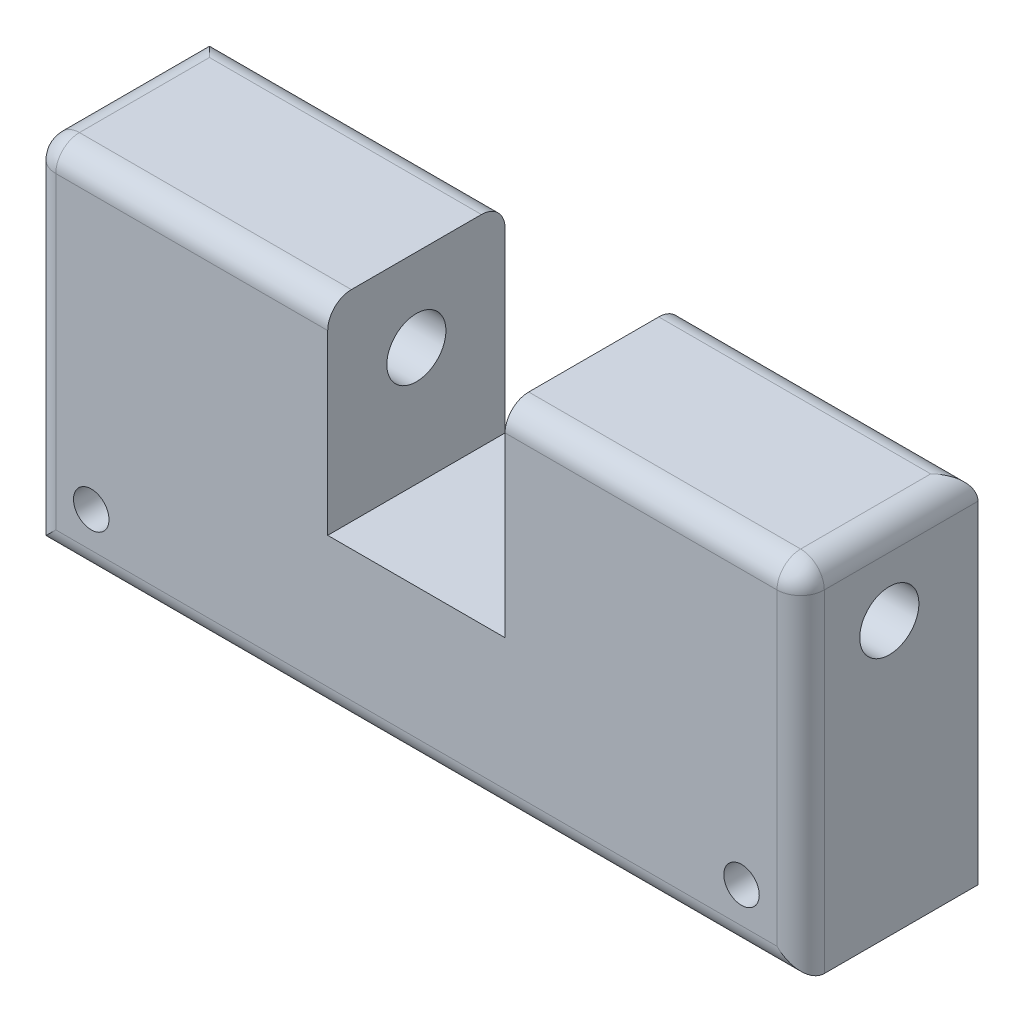
ISO-10303-21;
HEADER;
FILE_DESCRIPTION(('STEP AP214'),'2;1');
FILE_NAME('part.step','',(''),(''),'','','');
FILE_SCHEMA(('AUTOMOTIVE_DESIGN { 1 0 10303 214 1 1 1 1 }'));
ENDSEC;
DATA;
#1=APPLICATION_CONTEXT('core data for automotive mechanical design processes');
#2=APPLICATION_PROTOCOL_DEFINITION('international standard','automotive_design',2000,#1);
#3=PRODUCT_CONTEXT('',#1,'mechanical');
#4=PRODUCT('Part','Part','',(#3));
#5=PRODUCT_RELATED_PRODUCT_CATEGORY('part','',(#4));
#6=PRODUCT_DEFINITION_FORMATION('','',#4);
#7=PRODUCT_DEFINITION_CONTEXT('part definition',#1,'design');
#8=PRODUCT_DEFINITION('design','',#6,#7);
#9=PRODUCT_DEFINITION_SHAPE('','',#8);
#10=(LENGTH_UNIT() NAMED_UNIT(*) SI_UNIT(.MILLI.,.METRE.));
#11=(NAMED_UNIT(*) PLANE_ANGLE_UNIT() SI_UNIT($,.RADIAN.));
#12=(NAMED_UNIT(*) SI_UNIT($,.STERADIAN.) SOLID_ANGLE_UNIT());
#13=UNCERTAINTY_MEASURE_WITH_UNIT(LENGTH_MEASURE(1.E-05),#10,'distance_accuracy_value','');
#14=(GEOMETRIC_REPRESENTATION_CONTEXT(3) GLOBAL_UNCERTAINTY_ASSIGNED_CONTEXT((#13)) GLOBAL_UNIT_ASSIGNED_CONTEXT((#10,
#11,#12)) REPRESENTATION_CONTEXT('',''));
#15=CARTESIAN_POINT('',(0.,0.,0.));
#16=DIRECTION('',(0.,0.,1.));
#17=DIRECTION('',(1.,0.,0.));
#18=AXIS2_PLACEMENT_3D('',#15,#16,#17);
#19=CARTESIAN_POINT('',(-22.4999999999999,15.5999999999998,15.));
#20=DIRECTION('',(0.,-1.,0.));
#21=DIRECTION('',(0.,0.,-1.));
#22=AXIS2_PLACEMENT_3D('',#19,#20,#21);
#23=PLANE('',#22);
#24=DIRECTION('',(0.,0.,1.));
#25=VECTOR('',#24,1.);
#26=CARTESIAN_POINT('',(2.50000000000001,15.5999999999998,-60.));
#27=LINE('',#26,#25);
#28=CARTESIAN_POINT('',(2.50000000000001,15.5999999999998,2.));
#29=VERTEX_POINT('',#28);
#30=CARTESIAN_POINT('',(2.50000000000001,15.5999999999998,13.));
#31=VERTEX_POINT('',#30);
#32=EDGE_CURVE('E162',#29,#31,#27,.T.);
#33=ORIENTED_EDGE('',*,*,#32,.F.);
#34=DIRECTION('',(-1.,0.,0.));
#35=VECTOR('',#34,1.);
#36=CARTESIAN_POINT('',(-22.4999999999999,15.5999999999998,2.));
#37=LINE('',#36,#35);
#38=CARTESIAN_POINT('',(-20.4999999999999,15.5999999999998,2.));
#39=VERTEX_POINT('',#38);
#40=EDGE_CURVE('E219',#29,#39,#37,.T.);
#41=ORIENTED_EDGE('',*,*,#40,.T.);
#42=DIRECTION('',(0.,0.,-1.));
#43=VECTOR('',#42,1.);
#44=CARTESIAN_POINT('',(-20.4999999999999,15.5999999999998,15.));
#45=LINE('',#44,#43);
#46=CARTESIAN_POINT('',(-20.4999999999999,15.5999999999998,13.));
#47=VERTEX_POINT('',#46);
#48=EDGE_CURVE('E217',#39,#47,#45,.F.);
#49=ORIENTED_EDGE('',*,*,#48,.T.);
#50=DIRECTION('',(-1.,0.,0.));
#51=VECTOR('',#50,1.);
#52=CARTESIAN_POINT('',(-22.4999999999999,15.5999999999998,13.));
#53=LINE('',#52,#51);
#54=EDGE_CURVE('E215',#47,#31,#53,.F.);
#55=ORIENTED_EDGE('',*,*,#54,.T.);
#56=EDGE_LOOP('',(#33,#41,#49,#55));
#57=FACE_BOUND('',#56,.T.);
#58=ADVANCED_FACE('F32',(#57),#23,.F.);
#59=CARTESIAN_POINT('',(52.5000000000001,8.59999999999981,7.5));
#60=DIRECTION('',(-1.,0.,0.));
#61=DIRECTION('',(0.,0.,1.));
#62=AXIS2_PLACEMENT_3D('',#59,#60,#61);
#63=CYLINDRICAL_SURFACE('',#62,2.5);
#64=CARTESIAN_POINT('',(2.50000000000001,8.59999999999981,7.5));
#65=DIRECTION('',(-1.,0.,0.));
#66=DIRECTION('',(0.,-1.,0.));
#67=AXIS2_PLACEMENT_3D('',#64,#65,#66);
#68=CIRCLE('',#67,2.5);
#69=CARTESIAN_POINT('',(2.50000000000001,6.09999999999981,7.5));
#70=VERTEX_POINT('',#69);
#71=EDGE_CURVE('E171',#70,#70,#68,.F.);
#72=ORIENTED_EDGE('',*,*,#71,.T.);
#73=EDGE_LOOP('',(#72));
#74=FACE_BOUND('',#73,.T.);
#75=CARTESIAN_POINT('',(-22.4999999999999,8.59999999999981,7.5));
#76=DIRECTION('',(-1.,0.,0.));
#77=DIRECTION('',(0.,0.,1.));
#78=AXIS2_PLACEMENT_3D('',#75,#76,#77);
#79=CIRCLE('',#78,2.5);
#80=CARTESIAN_POINT('',(-22.4999999999999,8.59999999999981,10.));
#81=VERTEX_POINT('',#80);
#82=EDGE_CURVE('E174',#81,#81,#79,.T.);
#83=ORIENTED_EDGE('',*,*,#82,.T.);
#84=EDGE_LOOP('',(#83));
#85=FACE_BOUND('',#84,.T.);
#86=ADVANCED_FACE('F352',(#74,#85),#63,.F.);
#87=CARTESIAN_POINT('',(0.,0.,15.));
#88=DIRECTION('',(0.,0.,-1.));
#89=DIRECTION('',(-1.,0.,0.));
#90=AXIS2_PLACEMENT_3D('',#87,#88,#89);
#91=PLANE('',#90);
#92=DIRECTION('',(0.,1.,0.));
#93=VECTOR('',#92,1.);
#94=CARTESIAN_POINT('',(40.5,0.,15.));
#95=LINE('',#94,#93);
#96=CARTESIAN_POINT('',(40.5,-12.5,15.));
#97=VERTEX_POINT('',#96);
#98=CARTESIAN_POINT('',(40.5,13.5999999999998,15.));
#99=VERTEX_POINT('',#98);
#100=EDGE_CURVE('E49',#97,#99,#95,.T.);
#101=ORIENTED_EDGE('',*,*,#100,.T.);
#102=DIRECTION('',(-1.,0.,0.));
#103=VECTOR('',#102,1.);
#104=CARTESIAN_POINT('',(0.,13.5999999999998,15.));
#105=LINE('',#104,#103);
#106=CARTESIAN_POINT('',(17.5,13.5999999999998,15.));
#107=VERTEX_POINT('',#106);
#108=EDGE_CURVE('E41',#99,#107,#105,.T.);
#109=ORIENTED_EDGE('',*,*,#108,.T.);
#110=DIRECTION('',(0.,1.,0.));
#111=VECTOR('',#110,1.);
#112=CARTESIAN_POINT('',(17.5,15.5999999999998,15.));
#113=LINE('',#112,#111);
#114=CARTESIAN_POINT('',(17.5,-1.40000000000019,15.));
#115=VERTEX_POINT('',#114);
#116=EDGE_CURVE('E154',#115,#107,#113,.T.);
#117=ORIENTED_EDGE('',*,*,#116,.F.);
#118=DIRECTION('',(1.,0.,0.));
#119=VECTOR('',#118,1.);
#120=CARTESIAN_POINT('',(2.50000000000001,-1.40000000000019,15.));
#121=LINE('',#120,#119);
#122=CARTESIAN_POINT('',(2.50000000000001,-1.40000000000019,15.));
#123=VERTEX_POINT('',#122);
#124=EDGE_CURVE('E144',#123,#115,#121,.T.);
#125=ORIENTED_EDGE('',*,*,#124,.F.);
#126=DIRECTION('',(0.,-1.,0.));
#127=VECTOR('',#126,1.);
#128=CARTESIAN_POINT('',(2.50000000000001,15.5999999999998,15.));
#129=LINE('',#128,#127);
#130=CARTESIAN_POINT('',(2.50000000000001,13.5999999999998,15.));
#131=VERTEX_POINT('',#130);
#132=EDGE_CURVE('E132',#131,#123,#129,.T.);
#133=ORIENTED_EDGE('',*,*,#132,.F.);
#134=DIRECTION('',(-1.,0.,0.));
#135=VECTOR('',#134,1.);
#136=CARTESIAN_POINT('',(0.,13.5999999999998,15.));
#137=LINE('',#136,#135);
#138=CARTESIAN_POINT('',(-20.4999999999999,13.5999999999998,15.));
#139=VERTEX_POINT('',#138);
#140=EDGE_CURVE('E245',#131,#139,#137,.T.);
#141=ORIENTED_EDGE('',*,*,#140,.T.);
#142=DIRECTION('',(0.,-1.,0.));
#143=VECTOR('',#142,1.);
#144=CARTESIAN_POINT('',(-20.4999999999999,0.,15.));
#145=LINE('',#144,#143);
#146=CARTESIAN_POINT('',(-20.4999999999999,-12.5,15.));
#147=VERTEX_POINT('',#146);
#148=EDGE_CURVE('E242',#139,#147,#145,.T.);
#149=ORIENTED_EDGE('',*,*,#148,.T.);
#150=DIRECTION('',(1.,0.,0.));
#151=VECTOR('',#150,1.);
#152=CARTESIAN_POINT('',(0.,-12.5,15.));
#153=LINE('',#152,#151);
#154=EDGE_CURVE('E54',#147,#97,#153,.T.);
#155=ORIENTED_EDGE('',*,*,#154,.T.);
#156=EDGE_LOOP('',(#101,#109,#117,#125,#133,#141,#149,#155));
#157=FACE_BOUND('',#156,.T.);
#158=CARTESIAN_POINT('',(-17.4999999999999,-9.5,15.));
#159=DIRECTION('',(0.,0.,1.));
#160=DIRECTION('',(1.,0.,0.));
#161=AXIS2_PLACEMENT_3D('',#158,#159,#160);
#162=CIRCLE('',#161,1.5);
#163=CARTESIAN_POINT('',(-15.9999999999999,-9.5,15.));
#164=VERTEX_POINT('',#163);
#165=EDGE_CURVE('E185',#164,#164,#162,.T.);
#166=ORIENTED_EDGE('',*,*,#165,.F.);
#167=EDGE_LOOP('',(#166));
#168=FACE_BOUND('',#167,.T.);
#169=CARTESIAN_POINT('',(37.5,-9.50000000000001,15.));
#170=DIRECTION('',(0.,0.,1.));
#171=DIRECTION('',(1.,0.,0.));
#172=AXIS2_PLACEMENT_3D('',#169,#170,#171);
#173=CIRCLE('',#172,1.5);
#174=CARTESIAN_POINT('',(39.,-9.50000000000001,15.));
#175=VERTEX_POINT('',#174);
#176=EDGE_CURVE('E178',#175,#175,#173,.T.);
#177=ORIENTED_EDGE('',*,*,#176,.F.);
#178=EDGE_LOOP('',(#177));
#179=FACE_BOUND('',#178,.T.);
#180=ADVANCED_FACE('F156',(#157,#168,#179),#91,.F.);
#181=CARTESIAN_POINT('',(0.,0.,0.));
#182=DIRECTION('',(0.,0.,-1.));
#183=DIRECTION('',(-1.,0.,0.));
#184=AXIS2_PLACEMENT_3D('',#181,#182,#183);
#185=PLANE('',#184);
#186=DIRECTION('',(0.,-1.,0.));
#187=VECTOR('',#186,1.);
#188=CARTESIAN_POINT('',(17.5,0.,0.));
#189=LINE('',#188,#187);
#190=CARTESIAN_POINT('',(17.5,13.5999999999998,0.));
#191=VERTEX_POINT('',#190);
#192=CARTESIAN_POINT('',(17.5,-1.40000000000019,0.));
#193=VERTEX_POINT('',#192);
#194=EDGE_CURVE('E169',#191,#193,#189,.T.);
#195=ORIENTED_EDGE('',*,*,#194,.F.);
#196=DIRECTION('',(-1.,0.,0.));
#197=VECTOR('',#196,1.);
#198=CARTESIAN_POINT('',(42.5,13.5999999999998,0.));
#199=LINE('',#198,#197);
#200=CARTESIAN_POINT('',(42.5,13.5999999999998,0.));
#201=VERTEX_POINT('',#200);
#202=EDGE_CURVE('E237',#191,#201,#199,.F.);
#203=ORIENTED_EDGE('',*,*,#202,.T.);
#204=DIRECTION('',(0.,1.,0.));
#205=VECTOR('',#204,1.);
#206=CARTESIAN_POINT('',(42.5,-14.5,0.));
#207=LINE('',#206,#205);
#208=CARTESIAN_POINT('',(42.5,-14.5,0.));
#209=VERTEX_POINT('',#208);
#210=EDGE_CURVE('E196',#209,#201,#207,.T.);
#211=ORIENTED_EDGE('',*,*,#210,.F.);
#212=DIRECTION('',(1.,0.,0.));
#213=VECTOR('',#212,1.);
#214=CARTESIAN_POINT('',(-22.4999999999999,-14.5,0.));
#215=LINE('',#214,#213);
#216=CARTESIAN_POINT('',(-22.4999999999999,-14.5,0.));
#217=VERTEX_POINT('',#216);
#218=EDGE_CURVE('E193',#217,#209,#215,.T.);
#219=ORIENTED_EDGE('',*,*,#218,.F.);
#220=DIRECTION('',(0.,-1.,0.));
#221=VECTOR('',#220,1.);
#222=CARTESIAN_POINT('',(-22.4999999999999,-14.5,0.));
#223=LINE('',#222,#221);
#224=CARTESIAN_POINT('',(-22.4999999999999,13.5999999999998,0.));
#225=VERTEX_POINT('',#224);
#226=EDGE_CURVE('E188',#225,#217,#223,.T.);
#227=ORIENTED_EDGE('',*,*,#226,.F.);
#228=DIRECTION('',(-1.,0.,0.));
#229=VECTOR('',#228,1.);
#230=CARTESIAN_POINT('',(2.50000000000001,13.5999999999998,0.));
#231=LINE('',#230,#229);
#232=CARTESIAN_POINT('',(2.50000000000001,13.5999999999998,0.));
#233=VERTEX_POINT('',#232);
#234=EDGE_CURVE('E235',#225,#233,#231,.F.);
#235=ORIENTED_EDGE('',*,*,#234,.T.);
#236=DIRECTION('',(0.,1.,0.));
#237=VECTOR('',#236,1.);
#238=CARTESIAN_POINT('',(2.50000000000001,0.,0.));
#239=LINE('',#238,#237);
#240=CARTESIAN_POINT('',(2.50000000000001,-1.40000000000019,0.));
#241=VERTEX_POINT('',#240);
#242=EDGE_CURVE('E172',#241,#233,#239,.T.);
#243=ORIENTED_EDGE('',*,*,#242,.F.);
#244=DIRECTION('',(-1.,0.,0.));
#245=VECTOR('',#244,1.);
#246=CARTESIAN_POINT('',(0.,-1.40000000000019,0.));
#247=LINE('',#246,#245);
#248=EDGE_CURVE('E152',#193,#241,#247,.T.);
#249=ORIENTED_EDGE('',*,*,#248,.F.);
#250=EDGE_LOOP('',(#195,#203,#211,#219,#227,#235,#243,#249));
#251=FACE_BOUND('',#250,.T.);
#252=CARTESIAN_POINT('',(-17.4999999999999,-9.5,0.));
#253=DIRECTION('',(0.,0.,1.));
#254=DIRECTION('',(1.,0.,0.));
#255=AXIS2_PLACEMENT_3D('',#252,#253,#254);
#256=CIRCLE('',#255,1.5);
#257=CARTESIAN_POINT('',(-15.9999999999999,-9.5,0.));
#258=VERTEX_POINT('',#257);
#259=EDGE_CURVE('E181',#258,#258,#256,.T.);
#260=ORIENTED_EDGE('',*,*,#259,.T.);
#261=EDGE_LOOP('',(#260));
#262=FACE_BOUND('',#261,.T.);
#263=CARTESIAN_POINT('',(37.5,-9.50000000000001,0.));
#264=DIRECTION('',(0.,0.,1.));
#265=DIRECTION('',(1.,0.,0.));
#266=AXIS2_PLACEMENT_3D('',#263,#264,#265);
#267=CIRCLE('',#266,1.5);
#268=CARTESIAN_POINT('',(39.,-9.50000000000001,0.));
#269=VERTEX_POINT('',#268);
#270=EDGE_CURVE('E182',#269,#269,#267,.T.);
#271=ORIENTED_EDGE('',*,*,#270,.T.);
#272=EDGE_LOOP('',(#271));
#273=FACE_BOUND('',#272,.T.);
#274=ADVANCED_FACE('F314',(#251,#262,#273),#185,.T.);
#275=CARTESIAN_POINT('',(-22.4999999999999,-14.5,15.));
#276=DIRECTION('',(1.,0.,0.));
#277=DIRECTION('',(0.,0.,-1.));
#278=AXIS2_PLACEMENT_3D('',#275,#276,#277);
#279=PLANE('',#278);
#280=ORIENTED_EDGE('',*,*,#82,.F.);
#281=EDGE_LOOP('',(#280));
#282=FACE_BOUND('',#281,.T.);
#283=DIRECTION('',(0.,-1.,0.));
#284=VECTOR('',#283,1.);
#285=CARTESIAN_POINT('',(-22.4999999999999,-14.5,13.));
#286=LINE('',#285,#284);
#287=CARTESIAN_POINT('',(-22.4999999999999,-14.5,13.));
#288=VERTEX_POINT('',#287);
#289=CARTESIAN_POINT('',(-22.4999999999999,13.5999999999998,13.));
#290=VERTEX_POINT('',#289);
#291=EDGE_CURVE('E210',#288,#290,#286,.F.);
#292=ORIENTED_EDGE('',*,*,#291,.T.);
#293=DIRECTION('',(0.,0.,-1.));
#294=VECTOR('',#293,1.);
#295=CARTESIAN_POINT('',(-22.4999999999999,13.5999999999998,15.));
#296=LINE('',#295,#294);
#297=EDGE_CURVE('E212',#290,#225,#296,.T.);
#298=ORIENTED_EDGE('',*,*,#297,.T.);
#299=ORIENTED_EDGE('',*,*,#226,.T.);
#300=DIRECTION('',(0.,0.,-1.));
#301=VECTOR('',#300,1.);
#302=CARTESIAN_POINT('',(-22.4999999999999,-14.5,15.));
#303=LINE('',#302,#301);
#304=EDGE_CURVE('E201',#288,#217,#303,.T.);
#305=ORIENTED_EDGE('',*,*,#304,.F.);
#306=EDGE_LOOP('',(#292,#298,#299,#305));
#307=FACE_BOUND('',#306,.T.);
#308=ADVANCED_FACE('F375',(#282,#307),#279,.F.);
#309=CARTESIAN_POINT('',(-22.4999999999999,-14.5,15.));
#310=DIRECTION('',(0.,1.,0.));
#311=DIRECTION('',(0.,0.,1.));
#312=AXIS2_PLACEMENT_3D('',#309,#310,#311);
#313=PLANE('',#312);
#314=DIRECTION('',(0.,0.,-1.));
#315=VECTOR('',#314,1.);
#316=CARTESIAN_POINT('',(42.5,-14.5,15.));
#317=LINE('',#316,#315);
#318=CARTESIAN_POINT('',(42.5,-14.5,13.));
#319=VERTEX_POINT('',#318);
#320=EDGE_CURVE('E199',#319,#209,#317,.T.);
#321=ORIENTED_EDGE('',*,*,#320,.F.);
#322=DIRECTION('',(1.,0.,0.));
#323=VECTOR('',#322,1.);
#324=CARTESIAN_POINT('',(-22.4999999999999,-14.5,13.));
#325=LINE('',#324,#323);
#326=EDGE_CURVE('E11',#319,#288,#325,.F.);
#327=ORIENTED_EDGE('',*,*,#326,.T.);
#328=ORIENTED_EDGE('',*,*,#304,.T.);
#329=ORIENTED_EDGE('',*,*,#218,.T.);
#330=EDGE_LOOP('',(#321,#327,#328,#329));
#331=FACE_BOUND('',#330,.T.);
#332=ADVANCED_FACE('F308',(#331),#313,.F.);
#333=CARTESIAN_POINT('',(42.5,-14.5,15.));
#334=DIRECTION('',(-1.,0.,0.));
#335=DIRECTION('',(0.,0.,1.));
#336=AXIS2_PLACEMENT_3D('',#333,#334,#335);
#337=PLANE('',#336);
#338=CARTESIAN_POINT('',(42.5,8.59999999999981,7.5));
#339=DIRECTION('',(-1.,0.,0.));
#340=DIRECTION('',(0.,0.,1.));
#341=AXIS2_PLACEMENT_3D('',#338,#339,#340);
#342=CIRCLE('',#341,2.5);
#343=CARTESIAN_POINT('',(42.5,8.59999999999981,10.));
#344=VERTEX_POINT('',#343);
#345=EDGE_CURVE('E177',#344,#344,#342,.T.);
#346=ORIENTED_EDGE('',*,*,#345,.T.);
#347=EDGE_LOOP('',(#346));
#348=FACE_BOUND('',#347,.T.);
#349=ORIENTED_EDGE('',*,*,#210,.T.);
#350=DIRECTION('',(0.,0.,-1.));
#351=VECTOR('',#350,1.);
#352=CARTESIAN_POINT('',(42.5,13.5999999999998,15.));
#353=LINE('',#352,#351);
#354=CARTESIAN_POINT('',(42.5,13.5999999999998,13.));
#355=VERTEX_POINT('',#354);
#356=EDGE_CURVE('E229',#201,#355,#353,.F.);
#357=ORIENTED_EDGE('',*,*,#356,.T.);
#358=DIRECTION('',(0.,1.,0.));
#359=VECTOR('',#358,1.);
#360=CARTESIAN_POINT('',(42.5,-14.5,13.));
#361=LINE('',#360,#359);
#362=EDGE_CURVE('E227',#355,#319,#361,.F.);
#363=ORIENTED_EDGE('',*,*,#362,.T.);
#364=ORIENTED_EDGE('',*,*,#320,.T.);
#365=EDGE_LOOP('',(#349,#357,#363,#364));
#366=FACE_BOUND('',#365,.T.);
#367=ADVANCED_FACE('F306',(#348,#366),#337,.F.);
#368=DIRECTION('',(0.,0.,-1.));
#369=VECTOR('',#368,1.);
#370=CARTESIAN_POINT('',(40.5,15.5999999999998,15.));
#371=LINE('',#370,#369);
#372=CARTESIAN_POINT('',(40.5,15.5999999999998,13.));
#373=VERTEX_POINT('',#372);
#374=CARTESIAN_POINT('',(40.5,15.5999999999998,2.));
#375=VERTEX_POINT('',#374);
#376=EDGE_CURVE('E223',#373,#375,#371,.T.);
#377=ORIENTED_EDGE('',*,*,#376,.T.);
#378=DIRECTION('',(-1.,0.,0.));
#379=VECTOR('',#378,1.);
#380=CARTESIAN_POINT('',(17.5,15.5999999999998,2.));
#381=LINE('',#380,#379);
#382=CARTESIAN_POINT('',(17.5,15.5999999999998,2.));
#383=VERTEX_POINT('',#382);
#384=EDGE_CURVE('E225',#375,#383,#381,.T.);
#385=ORIENTED_EDGE('',*,*,#384,.T.);
#386=DIRECTION('',(0.,0.,1.));
#387=VECTOR('',#386,1.);
#388=CARTESIAN_POINT('',(17.5,15.5999999999998,-60.));
#389=LINE('',#388,#387);
#390=CARTESIAN_POINT('',(17.5,15.5999999999998,13.));
#391=VERTEX_POINT('',#390);
#392=EDGE_CURVE('E165',#383,#391,#389,.T.);
#393=ORIENTED_EDGE('',*,*,#392,.T.);
#394=DIRECTION('',(-1.,0.,0.));
#395=VECTOR('',#394,1.);
#396=CARTESIAN_POINT('',(-22.4999999999999,15.5999999999998,13.));
#397=LINE('',#396,#395);
#398=EDGE_CURVE('E221',#391,#373,#397,.F.);
#399=ORIENTED_EDGE('',*,*,#398,.T.);
#400=EDGE_LOOP('',(#377,#385,#393,#399));
#401=FACE_BOUND('',#400,.T.);
#402=ADVANCED_FACE('F289',(#401),#23,.F.);
#403=CARTESIAN_POINT('',(-17.4999999999999,-9.5,15.));
#404=DIRECTION('',(0.,0.,-1.));
#405=DIRECTION('',(-1.,0.,0.));
#406=AXIS2_PLACEMENT_3D('',#403,#404,#405);
#407=CYLINDRICAL_SURFACE('',#406,1.5);
#408=ORIENTED_EDGE('',*,*,#165,.T.);
#409=EDGE_LOOP('',(#408));
#410=FACE_BOUND('',#409,.T.);
#411=ORIENTED_EDGE('',*,*,#259,.F.);
#412=EDGE_LOOP('',(#411));
#413=FACE_BOUND('',#412,.T.);
#414=ADVANCED_FACE('F363',(#410,#413),#407,.F.);
#415=CARTESIAN_POINT('',(37.5,-9.50000000000001,15.));
#416=DIRECTION('',(0.,0.,-1.));
#417=DIRECTION('',(-1.,0.,0.));
#418=AXIS2_PLACEMENT_3D('',#415,#416,#417);
#419=CYLINDRICAL_SURFACE('',#418,1.5);
#420=ORIENTED_EDGE('',*,*,#176,.T.);
#421=EDGE_LOOP('',(#420));
#422=FACE_BOUND('',#421,.T.);
#423=ORIENTED_EDGE('',*,*,#270,.F.);
#424=EDGE_LOOP('',(#423));
#425=FACE_BOUND('',#424,.T.);
#426=ADVANCED_FACE('F368',(#422,#425),#419,.F.);
#427=CARTESIAN_POINT('',(17.5,8.59999999999981,7.5));
#428=DIRECTION('',(1.,0.,0.));
#429=DIRECTION('',(0.,0.,-1.));
#430=AXIS2_PLACEMENT_3D('',#427,#428,#429);
#431=CIRCLE('',#430,2.5);
#432=CARTESIAN_POINT('',(17.5,8.59999999999981,5.));
#433=VERTEX_POINT('',#432);
#434=EDGE_CURVE('E164',#433,#433,#431,.F.);
#435=ORIENTED_EDGE('',*,*,#434,.T.);
#436=EDGE_LOOP('',(#435));
#437=FACE_BOUND('',#436,.T.);
#438=ORIENTED_EDGE('',*,*,#345,.F.);
#439=EDGE_LOOP('',(#438));
#440=FACE_BOUND('',#439,.T.);
#441=ADVANCED_FACE('F359',(#437,#440),#63,.F.);
#442=CARTESIAN_POINT('',(2.50000000000001,15.5999999999998,-60.));
#443=DIRECTION('',(-1.,0.,0.));
#444=DIRECTION('',(0.,-1.,0.));
#445=AXIS2_PLACEMENT_3D('',#442,#443,#444);
#446=PLANE('',#445);
#447=ORIENTED_EDGE('',*,*,#242,.T.);
#448=CARTESIAN_POINT('',(2.50000000000001,13.5999999999998,2.));
#449=DIRECTION('',(-1.,0.,0.));
#450=DIRECTION('',(0.,-1.,0.));
#451=AXIS2_PLACEMENT_3D('',#448,#449,#450);
#452=CIRCLE('',#451,2.);
#453=EDGE_CURVE('E240',#233,#29,#452,.F.);
#454=ORIENTED_EDGE('',*,*,#453,.T.);
#455=ORIENTED_EDGE('',*,*,#32,.T.);
#456=CARTESIAN_POINT('',(2.50000000000001,13.5999999999998,13.));
#457=DIRECTION('',(-1.,0.,0.));
#458=DIRECTION('',(0.,-1.,0.));
#459=AXIS2_PLACEMENT_3D('',#456,#457,#458);
#460=CIRCLE('',#459,2.);
#461=EDGE_CURVE('E141',#31,#131,#460,.F.);
#462=ORIENTED_EDGE('',*,*,#461,.T.);
#463=ORIENTED_EDGE('',*,*,#132,.T.);
#464=DIRECTION('',(0.,0.,1.));
#465=VECTOR('',#464,1.);
#466=CARTESIAN_POINT('',(2.50000000000001,-1.40000000000019,-60.));
#467=LINE('',#466,#465);
#468=EDGE_CURVE('E137',#241,#123,#467,.T.);
#469=ORIENTED_EDGE('',*,*,#468,.F.);
#470=EDGE_LOOP('',(#447,#454,#455,#462,#463,#469));
#471=FACE_BOUND('',#470,.T.);
#472=ORIENTED_EDGE('',*,*,#71,.F.);
#473=EDGE_LOOP('',(#472));
#474=FACE_BOUND('',#473,.T.);
#475=ADVANCED_FACE('F135',(#471,#474),#446,.F.);
#476=CARTESIAN_POINT('',(17.5,15.5999999999998,-60.));
#477=DIRECTION('',(1.,0.,0.));
#478=DIRECTION('',(0.,0.,-1.));
#479=AXIS2_PLACEMENT_3D('',#476,#477,#478);
#480=PLANE('',#479);
#481=ORIENTED_EDGE('',*,*,#392,.F.);
#482=CARTESIAN_POINT('',(17.5,13.5999999999998,2.));
#483=DIRECTION('',(1.,0.,0.));
#484=DIRECTION('',(0.,0.,-1.));
#485=AXIS2_PLACEMENT_3D('',#482,#483,#484);
#486=CIRCLE('',#485,2.);
#487=EDGE_CURVE('E233',#383,#191,#486,.F.);
#488=ORIENTED_EDGE('',*,*,#487,.T.);
#489=ORIENTED_EDGE('',*,*,#194,.T.);
#490=DIRECTION('',(0.,0.,1.));
#491=VECTOR('',#490,1.);
#492=CARTESIAN_POINT('',(17.5,-1.40000000000019,-60.));
#493=LINE('',#492,#491);
#494=EDGE_CURVE('E153',#193,#115,#493,.T.);
#495=ORIENTED_EDGE('',*,*,#494,.T.);
#496=ORIENTED_EDGE('',*,*,#116,.T.);
#497=CARTESIAN_POINT('',(17.5,13.5999999999998,13.));
#498=DIRECTION('',(1.,0.,0.));
#499=DIRECTION('',(0.,0.,-1.));
#500=AXIS2_PLACEMENT_3D('',#497,#498,#499);
#501=CIRCLE('',#500,2.);
#502=EDGE_CURVE('E231',#107,#391,#501,.F.);
#503=ORIENTED_EDGE('',*,*,#502,.T.);
#504=EDGE_LOOP('',(#481,#488,#489,#495,#496,#503));
#505=FACE_BOUND('',#504,.T.);
#506=ORIENTED_EDGE('',*,*,#434,.F.);
#507=EDGE_LOOP('',(#506));
#508=FACE_BOUND('',#507,.T.);
#509=ADVANCED_FACE('F292',(#505,#508),#480,.F.);
#510=CARTESIAN_POINT('',(2.50000000000001,-1.40000000000019,-60.));
#511=DIRECTION('',(0.,-1.,0.));
#512=DIRECTION('',(1.,0.,0.));
#513=AXIS2_PLACEMENT_3D('',#510,#511,#512);
#514=PLANE('',#513);
#515=ORIENTED_EDGE('',*,*,#248,.T.);
#516=ORIENTED_EDGE('',*,*,#468,.T.);
#517=ORIENTED_EDGE('',*,*,#124,.T.);
#518=ORIENTED_EDGE('',*,*,#494,.F.);
#519=EDGE_LOOP('',(#515,#516,#517,#518));
#520=FACE_BOUND('',#519,.T.);
#521=ADVANCED_FACE('F148',(#520),#514,.F.);
#522=CARTESIAN_POINT('',(-22.4999999999999,13.5999999999998,2.));
#523=DIRECTION('',(1.,0.,0.));
#524=DIRECTION('',(0.,0.,-1.));
#525=AXIS2_PLACEMENT_3D('',#522,#523,#524);
#526=CYLINDRICAL_SURFACE('',#525,2.);
#527=ORIENTED_EDGE('',*,*,#487,.F.);
#528=ORIENTED_EDGE('',*,*,#384,.F.);
#529=CARTESIAN_POINT('',(40.5,13.5999999999998,2.));
#530=DIRECTION('',(0.707106781186547,0.,0.707106781186547));
#531=DIRECTION('',(0.707106781186547,0.,-0.707106781186547));
#532=AXIS2_PLACEMENT_3D('',#529,#530,#531);
#533=ELLIPSE('',#532,2.82842712474619,2.);
#534=EDGE_CURVE('E36',#201,#375,#533,.T.);
#535=ORIENTED_EDGE('',*,*,#534,.F.);
#536=ORIENTED_EDGE('',*,*,#202,.F.);
#537=EDGE_LOOP('',(#527,#528,#535,#536));
#538=FACE_BOUND('',#537,.T.);
#539=ADVANCED_FACE('F34',(#538),#526,.T.);
#540=CARTESIAN_POINT('',(0.,13.5999999999998,13.));
#541=DIRECTION('',(-1.,0.,0.));
#542=DIRECTION('',(0.,0.,1.));
#543=AXIS2_PLACEMENT_3D('',#540,#541,#542);
#544=CYLINDRICAL_SURFACE('',#543,2.);
#545=ORIENTED_EDGE('',*,*,#502,.F.);
#546=ORIENTED_EDGE('',*,*,#108,.F.);
#547=CARTESIAN_POINT('',(40.5,13.5999999999998,13.));
#548=DIRECTION('',(1.,0.,0.));
#549=DIRECTION('',(0.,0.,-1.));
#550=AXIS2_PLACEMENT_3D('',#547,#548,#549);
#551=CIRCLE('',#550,2.);
#552=EDGE_CURVE('E271',#373,#99,#551,.T.);
#553=ORIENTED_EDGE('',*,*,#552,.F.);
#554=ORIENTED_EDGE('',*,*,#398,.F.);
#555=EDGE_LOOP('',(#545,#546,#553,#554));
#556=FACE_BOUND('',#555,.T.);
#557=ADVANCED_FACE('F297',(#556),#544,.T.);
#558=CARTESIAN_POINT('',(40.5,13.5999999999998,15.));
#559=DIRECTION('',(0.,0.,-1.));
#560=DIRECTION('',(-1.,0.,0.));
#561=AXIS2_PLACEMENT_3D('',#558,#559,#560);
#562=CYLINDRICAL_SURFACE('',#561,2.);
#563=ORIENTED_EDGE('',*,*,#534,.T.);
#564=ORIENTED_EDGE('',*,*,#376,.F.);
#565=CARTESIAN_POINT('',(40.5,13.5999999999998,13.));
#566=DIRECTION('',(0.,0.,1.));
#567=DIRECTION('',(1.,0.,0.));
#568=AXIS2_PLACEMENT_3D('',#565,#566,#567);
#569=CIRCLE('',#568,2.);
#570=EDGE_CURVE('E269',#355,#373,#569,.T.);
#571=ORIENTED_EDGE('',*,*,#570,.F.);
#572=ORIENTED_EDGE('',*,*,#356,.F.);
#573=EDGE_LOOP('',(#563,#564,#571,#572));
#574=FACE_BOUND('',#573,.T.);
#575=ADVANCED_FACE('F281',(#574),#562,.T.);
#576=CARTESIAN_POINT('',(40.5,13.5999999999998,13.));
#577=DIRECTION('',(0.,0.,1.));
#578=DIRECTION('',(1.,0.,0.));
#579=AXIS2_PLACEMENT_3D('',#576,#577,#578);
#580=SPHERICAL_SURFACE('',#579,2.);
#581=ORIENTED_EDGE('',*,*,#570,.T.);
#582=ORIENTED_EDGE('',*,*,#552,.T.);
#583=CARTESIAN_POINT('',(40.5,13.5999999999998,13.));
#584=DIRECTION('',(0.,1.,0.));
#585=DIRECTION('',(0.,0.,1.));
#586=AXIS2_PLACEMENT_3D('',#583,#584,#585);
#587=CIRCLE('',#586,2.);
#588=EDGE_CURVE('E266',#355,#99,#587,.F.);
#589=ORIENTED_EDGE('',*,*,#588,.F.);
#590=EDGE_LOOP('',(#581,#582,#589));
#591=FACE_BOUND('',#590,.T.);
#592=ADVANCED_FACE('F298',(#591),#580,.T.);
#593=CARTESIAN_POINT('',(40.5,0.,13.));
#594=DIRECTION('',(0.,1.,0.));
#595=DIRECTION('',(0.,0.,1.));
#596=AXIS2_PLACEMENT_3D('',#593,#594,#595);
#597=CYLINDRICAL_SURFACE('',#596,2.);
#598=ORIENTED_EDGE('',*,*,#588,.T.);
#599=ORIENTED_EDGE('',*,*,#100,.F.);
#600=CARTESIAN_POINT('',(40.5,-12.5,13.));
#601=DIRECTION('',(0.707106781186547,0.707106781186547,0.));
#602=DIRECTION('',(-0.707106781186547,0.707106781186547,0.));
#603=AXIS2_PLACEMENT_3D('',#600,#601,#602);
#604=ELLIPSE('',#603,2.82842712474619,2.);
#605=EDGE_CURVE('E263',#319,#97,#604,.F.);
#606=ORIENTED_EDGE('',*,*,#605,.F.);
#607=ORIENTED_EDGE('',*,*,#362,.F.);
#608=EDGE_LOOP('',(#598,#599,#606,#607));
#609=FACE_BOUND('',#608,.T.);
#610=ADVANCED_FACE('F302',(#609),#597,.T.);
#611=CARTESIAN_POINT('',(0.,-12.5,13.));
#612=DIRECTION('',(1.,0.,0.));
#613=DIRECTION('',(0.,0.,-1.));
#614=AXIS2_PLACEMENT_3D('',#611,#612,#613);
#615=CYLINDRICAL_SURFACE('',#614,2.);
#616=ORIENTED_EDGE('',*,*,#605,.T.);
#617=ORIENTED_EDGE('',*,*,#154,.F.);
#618=CARTESIAN_POINT('',(-20.4999999999999,-12.5,13.));
#619=DIRECTION('',(0.707106781186547,-0.707106781186547,0.));
#620=DIRECTION('',(-0.707106781186547,-0.707106781186547,0.));
#621=AXIS2_PLACEMENT_3D('',#618,#619,#620);
#622=ELLIPSE('',#621,2.82842712474619,2.);
#623=EDGE_CURVE('E260',#288,#147,#622,.F.);
#624=ORIENTED_EDGE('',*,*,#623,.F.);
#625=ORIENTED_EDGE('',*,*,#326,.F.);
#626=EDGE_LOOP('',(#616,#617,#624,#625));
#627=FACE_BOUND('',#626,.T.);
#628=ADVANCED_FACE('F342',(#627),#615,.T.);
#629=CARTESIAN_POINT('',(0.,13.5999999999998,13.));
#630=DIRECTION('',(-1.,0.,0.));
#631=DIRECTION('',(0.,0.,1.));
#632=AXIS2_PLACEMENT_3D('',#629,#630,#631);
#633=CYLINDRICAL_SURFACE('',#632,2.);
#634=ORIENTED_EDGE('',*,*,#461,.F.);
#635=ORIENTED_EDGE('',*,*,#54,.F.);
#636=CARTESIAN_POINT('',(-20.4999999999999,13.5999999999998,13.));
#637=DIRECTION('',(-1.,0.,0.));
#638=DIRECTION('',(0.,0.,1.));
#639=AXIS2_PLACEMENT_3D('',#636,#637,#638);
#640=CIRCLE('',#639,2.);
#641=EDGE_CURVE('E257',#139,#47,#640,.T.);
#642=ORIENTED_EDGE('',*,*,#641,.F.);
#643=ORIENTED_EDGE('',*,*,#140,.F.);
#644=EDGE_LOOP('',(#634,#635,#642,#643));
#645=FACE_BOUND('',#644,.T.);
#646=ADVANCED_FACE('F335',(#645),#633,.T.);
#647=CARTESIAN_POINT('',(-20.4999999999999,0.,13.));
#648=DIRECTION('',(0.,-1.,0.));
#649=DIRECTION('',(0.,0.,-1.));
#650=AXIS2_PLACEMENT_3D('',#647,#648,#649);
#651=CYLINDRICAL_SURFACE('',#650,2.);
#652=ORIENTED_EDGE('',*,*,#623,.T.);
#653=ORIENTED_EDGE('',*,*,#148,.F.);
#654=CARTESIAN_POINT('',(-20.4999999999999,13.5999999999998,13.));
#655=DIRECTION('',(0.,1.,0.));
#656=DIRECTION('',(0.,0.,1.));
#657=AXIS2_PLACEMENT_3D('',#654,#655,#656);
#658=CIRCLE('',#657,2.);
#659=EDGE_CURVE('E254',#290,#139,#658,.T.);
#660=ORIENTED_EDGE('',*,*,#659,.F.);
#661=ORIENTED_EDGE('',*,*,#291,.F.);
#662=EDGE_LOOP('',(#652,#653,#660,#661));
#663=FACE_BOUND('',#662,.T.);
#664=ADVANCED_FACE('F338',(#663),#651,.T.);
#665=CARTESIAN_POINT('',(-20.4999999999999,13.5999999999998,13.));
#666=DIRECTION('',(0.,0.,1.));
#667=DIRECTION('',(1.,0.,0.));
#668=AXIS2_PLACEMENT_3D('',#665,#666,#667);
#669=SPHERICAL_SURFACE('',#668,2.);
#670=ORIENTED_EDGE('',*,*,#659,.T.);
#671=ORIENTED_EDGE('',*,*,#641,.T.);
#672=CARTESIAN_POINT('',(-20.4999999999999,13.5999999999998,13.));
#673=DIRECTION('',(0.,0.,1.));
#674=DIRECTION('',(1.,0.,0.));
#675=AXIS2_PLACEMENT_3D('',#672,#673,#674);
#676=CIRCLE('',#675,2.);
#677=EDGE_CURVE('E251',#290,#47,#676,.F.);
#678=ORIENTED_EDGE('',*,*,#677,.F.);
#679=EDGE_LOOP('',(#670,#671,#678));
#680=FACE_BOUND('',#679,.T.);
#681=ADVANCED_FACE('F331',(#680),#669,.T.);
#682=CARTESIAN_POINT('',(-22.4999999999999,13.5999999999998,2.));
#683=DIRECTION('',(1.,0.,0.));
#684=DIRECTION('',(0.,0.,-1.));
#685=AXIS2_PLACEMENT_3D('',#682,#683,#684);
#686=CYLINDRICAL_SURFACE('',#685,2.);
#687=ORIENTED_EDGE('',*,*,#453,.F.);
#688=ORIENTED_EDGE('',*,*,#234,.F.);
#689=CARTESIAN_POINT('',(-20.4999999999999,13.5999999999998,2.));
#690=DIRECTION('',(0.707106781186547,0.,-0.707106781186547));
#691=DIRECTION('',(0.707106781186547,0.,0.707106781186547));
#692=AXIS2_PLACEMENT_3D('',#689,#690,#691);
#693=ELLIPSE('',#692,2.82842712474619,2.);
#694=EDGE_CURVE('E249',#39,#225,#693,.F.);
#695=ORIENTED_EDGE('',*,*,#694,.F.);
#696=ORIENTED_EDGE('',*,*,#40,.F.);
#697=EDGE_LOOP('',(#687,#688,#695,#696));
#698=FACE_BOUND('',#697,.T.);
#699=ADVANCED_FACE('F321',(#698),#686,.T.);
#700=CARTESIAN_POINT('',(-20.4999999999999,13.5999999999998,15.));
#701=DIRECTION('',(0.,0.,-1.));
#702=DIRECTION('',(-1.,0.,0.));
#703=AXIS2_PLACEMENT_3D('',#700,#701,#702);
#704=CYLINDRICAL_SURFACE('',#703,2.);
#705=ORIENTED_EDGE('',*,*,#677,.T.);
#706=ORIENTED_EDGE('',*,*,#48,.F.);
#707=ORIENTED_EDGE('',*,*,#694,.T.);
#708=ORIENTED_EDGE('',*,*,#297,.F.);
#709=EDGE_LOOP('',(#705,#706,#707,#708));
#710=FACE_BOUND('',#709,.T.);
#711=ADVANCED_FACE('F327',(#710),#704,.T.);
#712=CLOSED_SHELL('',(#58,#86,#180,#274,#308,#332,#367,#402,#414,#426,#441,#475,#509,#521,#539,
#557,#575,#592,#610,#628,#646,#664,#681,#699,#711));
#713=MANIFOLD_SOLID_BREP('B2',#712);
#714=ADVANCED_BREP_SHAPE_REPRESENTATION('',(#18,#713),#14);
#715=SHAPE_DEFINITION_REPRESENTATION(#9,#714);
ENDSEC;
END-ISO-10303-21;
